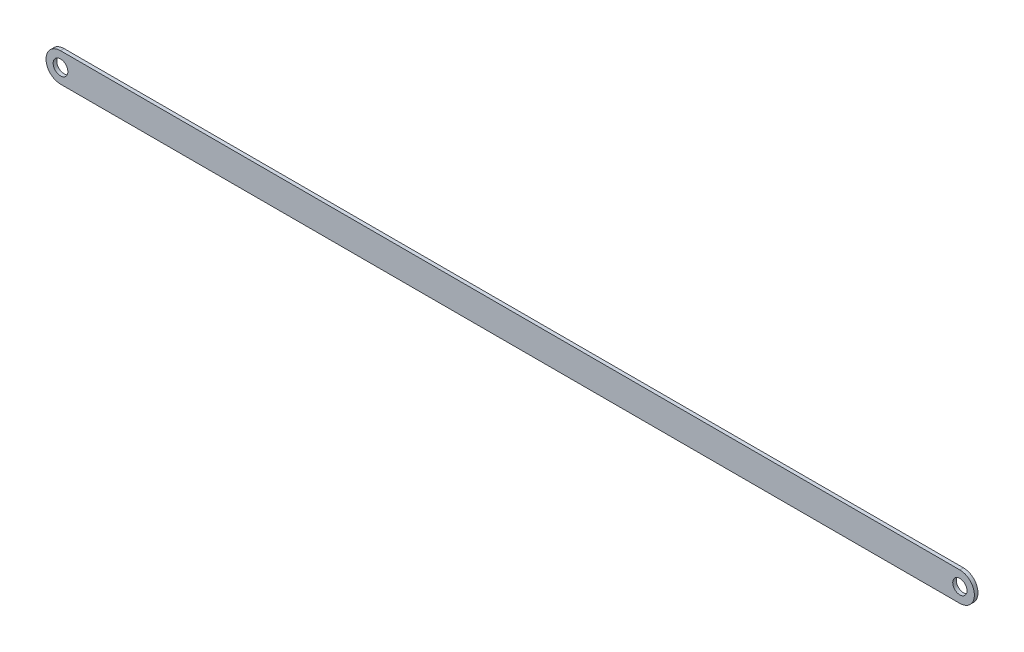
ISO-10303-21;
HEADER;
FILE_DESCRIPTION(('STEP AP214'),'2;1');
FILE_NAME('part.step','',(''),(''),'','','');
FILE_SCHEMA(('AUTOMOTIVE_DESIGN { 1 0 10303 214 1 1 1 1 }'));
ENDSEC;
DATA;
#1=APPLICATION_CONTEXT('core data for automotive mechanical design processes');
#2=APPLICATION_PROTOCOL_DEFINITION('international standard','automotive_design',2000,#1);
#3=PRODUCT_CONTEXT('',#1,'mechanical');
#4=PRODUCT('Part','Part','',(#3));
#5=PRODUCT_RELATED_PRODUCT_CATEGORY('part','',(#4));
#6=PRODUCT_DEFINITION_FORMATION('','',#4);
#7=PRODUCT_DEFINITION_CONTEXT('part definition',#1,'design');
#8=PRODUCT_DEFINITION('design','',#6,#7);
#9=PRODUCT_DEFINITION_SHAPE('','',#8);
#10=(LENGTH_UNIT() NAMED_UNIT(*) SI_UNIT(.MILLI.,.METRE.));
#11=(NAMED_UNIT(*) PLANE_ANGLE_UNIT() SI_UNIT($,.RADIAN.));
#12=(NAMED_UNIT(*) SI_UNIT($,.STERADIAN.) SOLID_ANGLE_UNIT());
#13=UNCERTAINTY_MEASURE_WITH_UNIT(LENGTH_MEASURE(1.E-05),#10,'distance_accuracy_value','');
#14=(GEOMETRIC_REPRESENTATION_CONTEXT(3) GLOBAL_UNCERTAINTY_ASSIGNED_CONTEXT((#13)) GLOBAL_UNIT_ASSIGNED_CONTEXT((#10,
#11,#12)) REPRESENTATION_CONTEXT('',''));
#15=CARTESIAN_POINT('',(0.,0.,0.));
#16=DIRECTION('',(0.,0.,1.));
#17=DIRECTION('',(1.,0.,0.));
#18=AXIS2_PLACEMENT_3D('',#15,#16,#17);
#19=CARTESIAN_POINT('',(0.,-12.7,3.175));
#20=DIRECTION('',(0.,1.,0.));
#21=DIRECTION('',(0.,0.,1.));
#22=AXIS2_PLACEMENT_3D('',#19,#20,#21);
#23=PLANE('',#22);
#24=DIRECTION('',(1.,0.,0.));
#25=VECTOR('',#24,1.);
#26=CARTESIAN_POINT('',(0.,-12.7,0.));
#27=LINE('',#26,#25);
#28=CARTESIAN_POINT('',(0.,-12.7,0.));
#29=VERTEX_POINT('',#28);
#30=CARTESIAN_POINT('',(787.4,-12.7,0.));
#31=VERTEX_POINT('',#30);
#32=EDGE_CURVE('E104',#29,#31,#27,.T.);
#33=ORIENTED_EDGE('',*,*,#32,.T.);
#34=DIRECTION('',(0.,0.,-1.));
#35=VECTOR('',#34,1.);
#36=CARTESIAN_POINT('',(787.4,-12.7,3.175));
#37=LINE('',#36,#35);
#38=CARTESIAN_POINT('',(787.4,-12.7,3.175));
#39=VERTEX_POINT('',#38);
#40=EDGE_CURVE('E11',#39,#31,#37,.T.);
#41=ORIENTED_EDGE('',*,*,#40,.F.);
#42=DIRECTION('',(1.,0.,0.));
#43=VECTOR('',#42,1.);
#44=CARTESIAN_POINT('',(0.,-12.7,3.175));
#45=LINE('',#44,#43);
#46=CARTESIAN_POINT('',(0.,-12.7,3.175));
#47=VERTEX_POINT('',#46);
#48=EDGE_CURVE('E83',#47,#39,#45,.T.);
#49=ORIENTED_EDGE('',*,*,#48,.F.);
#50=DIRECTION('',(0.,0.,-1.));
#51=VECTOR('',#50,1.);
#52=CARTESIAN_POINT('',(0.,-12.7,3.175));
#53=LINE('',#52,#51);
#54=EDGE_CURVE('E94',#47,#29,#53,.T.);
#55=ORIENTED_EDGE('',*,*,#54,.T.);
#56=EDGE_LOOP('',(#33,#41,#49,#55));
#57=FACE_BOUND('',#56,.T.);
#58=ADVANCED_FACE('F35',(#57),#23,.F.);
#59=CARTESIAN_POINT('',(787.4,0.,3.175));
#60=DIRECTION('',(0.,0.,-1.));
#61=DIRECTION('',(-1.,0.,0.));
#62=AXIS2_PLACEMENT_3D('',#59,#60,#61);
#63=CYLINDRICAL_SURFACE('',#62,12.7);
#64=CARTESIAN_POINT('',(787.4,0.,0.));
#65=DIRECTION('',(0.,0.,1.));
#66=DIRECTION('',(1.,0.,0.));
#67=AXIS2_PLACEMENT_3D('',#64,#65,#66);
#68=CIRCLE('',#67,12.7);
#69=CARTESIAN_POINT('',(787.4,12.7,0.));
#70=VERTEX_POINT('',#69);
#71=EDGE_CURVE('E88',#31,#70,#68,.T.);
#72=ORIENTED_EDGE('',*,*,#71,.T.);
#73=DIRECTION('',(0.,0.,-1.));
#74=VECTOR('',#73,1.);
#75=CARTESIAN_POINT('',(787.4,12.7,3.175));
#76=LINE('',#75,#74);
#77=CARTESIAN_POINT('',(787.4,12.7,3.175));
#78=VERTEX_POINT('',#77);
#79=EDGE_CURVE('E44',#78,#70,#76,.T.);
#80=ORIENTED_EDGE('',*,*,#79,.F.);
#81=CARTESIAN_POINT('',(787.4,0.,3.175));
#82=DIRECTION('',(0.,0.,1.));
#83=DIRECTION('',(1.,0.,0.));
#84=AXIS2_PLACEMENT_3D('',#81,#82,#83);
#85=CIRCLE('',#84,12.7);
#86=EDGE_CURVE('E78',#39,#78,#85,.T.);
#87=ORIENTED_EDGE('',*,*,#86,.F.);
#88=ORIENTED_EDGE('',*,*,#40,.T.);
#89=EDGE_LOOP('',(#72,#80,#87,#88));
#90=FACE_BOUND('',#89,.T.);
#91=ADVANCED_FACE('F87',(#90),#63,.T.);
#92=CARTESIAN_POINT('',(0.,12.7,3.175));
#93=DIRECTION('',(0.,1.,0.));
#94=DIRECTION('',(0.,0.,1.));
#95=AXIS2_PLACEMENT_3D('',#92,#93,#94);
#96=PLANE('',#95);
#97=DIRECTION('',(1.,0.,0.));
#98=VECTOR('',#97,1.);
#99=CARTESIAN_POINT('',(0.,12.7,0.));
#100=LINE('',#99,#98);
#101=CARTESIAN_POINT('',(0.,12.7,0.));
#102=VERTEX_POINT('',#101);
#103=EDGE_CURVE('E108',#102,#70,#100,.T.);
#104=ORIENTED_EDGE('',*,*,#103,.F.);
#105=DIRECTION('',(0.,0.,-1.));
#106=VECTOR('',#105,1.);
#107=CARTESIAN_POINT('',(0.,12.7,3.175));
#108=LINE('',#107,#106);
#109=CARTESIAN_POINT('',(0.,12.7,3.175));
#110=VERTEX_POINT('',#109);
#111=EDGE_CURVE('E68',#110,#102,#108,.T.);
#112=ORIENTED_EDGE('',*,*,#111,.F.);
#113=DIRECTION('',(1.,0.,0.));
#114=VECTOR('',#113,1.);
#115=CARTESIAN_POINT('',(0.,12.7,3.175));
#116=LINE('',#115,#114);
#117=EDGE_CURVE('E81',#110,#78,#116,.T.);
#118=ORIENTED_EDGE('',*,*,#117,.T.);
#119=ORIENTED_EDGE('',*,*,#79,.T.);
#120=EDGE_LOOP('',(#104,#112,#118,#119));
#121=FACE_BOUND('',#120,.T.);
#122=ADVANCED_FACE('F92',(#121),#96,.T.);
#123=CARTESIAN_POINT('',(0.,0.,3.175));
#124=DIRECTION('',(0.,0.,-1.));
#125=DIRECTION('',(-1.,0.,0.));
#126=AXIS2_PLACEMENT_3D('',#123,#124,#125);
#127=CYLINDRICAL_SURFACE('',#126,6.43006976920332);
#128=CARTESIAN_POINT('',(0.,0.,3.175));
#129=DIRECTION('',(0.,0.,1.));
#130=DIRECTION('',(1.,0.,0.));
#131=AXIS2_PLACEMENT_3D('',#128,#129,#130);
#132=CIRCLE('',#131,6.43006976920332);
#133=CARTESIAN_POINT('',(6.43006976920332,0.,3.175));
#134=VERTEX_POINT('',#133);
#135=EDGE_CURVE('E146',#134,#134,#132,.T.);
#136=ORIENTED_EDGE('',*,*,#135,.T.);
#137=EDGE_LOOP('',(#136));
#138=FACE_BOUND('',#137,.T.);
#139=CARTESIAN_POINT('',(0.,0.,0.));
#140=DIRECTION('',(0.,0.,1.));
#141=DIRECTION('',(1.,0.,0.));
#142=AXIS2_PLACEMENT_3D('',#139,#140,#141);
#143=CIRCLE('',#142,6.43006976920332);
#144=CARTESIAN_POINT('',(6.43006976920332,0.,0.));
#145=VERTEX_POINT('',#144);
#146=EDGE_CURVE('E101',#145,#145,#143,.T.);
#147=ORIENTED_EDGE('',*,*,#146,.F.);
#148=EDGE_LOOP('',(#147));
#149=FACE_BOUND('',#148,.T.);
#150=ADVANCED_FACE('F135',(#138,#149),#127,.F.);
#151=CARTESIAN_POINT('',(787.4,0.,3.175));
#152=DIRECTION('',(0.,0.,-1.));
#153=DIRECTION('',(-1.,0.,0.));
#154=AXIS2_PLACEMENT_3D('',#151,#152,#153);
#155=CYLINDRICAL_SURFACE('',#154,6.24775672436994);
#156=CARTESIAN_POINT('',(787.4,0.,3.175));
#157=DIRECTION('',(0.,0.,1.));
#158=DIRECTION('',(1.,0.,0.));
#159=AXIS2_PLACEMENT_3D('',#156,#157,#158);
#160=CIRCLE('',#159,6.24775672436994);
#161=CARTESIAN_POINT('',(793.64775672437,0.,3.175));
#162=VERTEX_POINT('',#161);
#163=EDGE_CURVE('E111',#162,#162,#160,.T.);
#164=ORIENTED_EDGE('',*,*,#163,.T.);
#165=EDGE_LOOP('',(#164));
#166=FACE_BOUND('',#165,.T.);
#167=CARTESIAN_POINT('',(787.4,0.,0.));
#168=DIRECTION('',(0.,0.,1.));
#169=DIRECTION('',(1.,0.,0.));
#170=AXIS2_PLACEMENT_3D('',#167,#168,#169);
#171=CIRCLE('',#170,6.24775672436994);
#172=CARTESIAN_POINT('',(793.64775672437,0.,0.));
#173=VERTEX_POINT('',#172);
#174=EDGE_CURVE('E98',#173,#173,#171,.T.);
#175=ORIENTED_EDGE('',*,*,#174,.F.);
#176=EDGE_LOOP('',(#175));
#177=FACE_BOUND('',#176,.T.);
#178=ADVANCED_FACE('F37',(#166,#177),#155,.F.);
#179=CARTESIAN_POINT('',(0.,0.,3.175));
#180=DIRECTION('',(0.,0.,-1.));
#181=DIRECTION('',(-1.,0.,0.));
#182=AXIS2_PLACEMENT_3D('',#179,#180,#181);
#183=CYLINDRICAL_SURFACE('',#182,12.7);
#184=CARTESIAN_POINT('',(0.,0.,0.));
#185=DIRECTION('',(0.,0.,1.));
#186=DIRECTION('',(1.,0.,0.));
#187=AXIS2_PLACEMENT_3D('',#184,#185,#186);
#188=CIRCLE('',#187,12.7);
#189=EDGE_CURVE('E71',#102,#29,#188,.T.);
#190=ORIENTED_EDGE('',*,*,#189,.T.);
#191=ORIENTED_EDGE('',*,*,#54,.F.);
#192=CARTESIAN_POINT('',(0.,0.,3.175));
#193=DIRECTION('',(0.,0.,1.));
#194=DIRECTION('',(1.,0.,0.));
#195=AXIS2_PLACEMENT_3D('',#192,#193,#194);
#196=CIRCLE('',#195,12.7);
#197=EDGE_CURVE('E52',#110,#47,#196,.T.);
#198=ORIENTED_EDGE('',*,*,#197,.F.);
#199=ORIENTED_EDGE('',*,*,#111,.T.);
#200=EDGE_LOOP('',(#190,#191,#198,#199));
#201=FACE_BOUND('',#200,.T.);
#202=ADVANCED_FACE('F123',(#201),#183,.T.);
#203=CARTESIAN_POINT('',(0.,0.,3.175));
#204=DIRECTION('',(0.,0.,1.));
#205=DIRECTION('',(1.,0.,0.));
#206=AXIS2_PLACEMENT_3D('',#203,#204,#205);
#207=PLANE('',#206);
#208=ORIENTED_EDGE('',*,*,#163,.F.);
#209=EDGE_LOOP('',(#208));
#210=FACE_BOUND('',#209,.T.);
#211=ORIENTED_EDGE('',*,*,#135,.F.);
#212=EDGE_LOOP('',(#211));
#213=FACE_BOUND('',#212,.T.);
#214=ORIENTED_EDGE('',*,*,#48,.T.);
#215=ORIENTED_EDGE('',*,*,#86,.T.);
#216=ORIENTED_EDGE('',*,*,#117,.F.);
#217=ORIENTED_EDGE('',*,*,#197,.T.);
#218=EDGE_LOOP('',(#214,#215,#216,#217));
#219=FACE_BOUND('',#218,.T.);
#220=ADVANCED_FACE('F79',(#210,#213,#219),#207,.T.);
#221=CARTESIAN_POINT('',(0.,0.,0.));
#222=DIRECTION('',(0.,0.,1.));
#223=DIRECTION('',(1.,0.,0.));
#224=AXIS2_PLACEMENT_3D('',#221,#222,#223);
#225=PLANE('',#224);
#226=ORIENTED_EDGE('',*,*,#174,.T.);
#227=EDGE_LOOP('',(#226));
#228=FACE_BOUND('',#227,.T.);
#229=ORIENTED_EDGE('',*,*,#146,.T.);
#230=EDGE_LOOP('',(#229));
#231=FACE_BOUND('',#230,.T.);
#232=ORIENTED_EDGE('',*,*,#32,.F.);
#233=ORIENTED_EDGE('',*,*,#189,.F.);
#234=ORIENTED_EDGE('',*,*,#103,.T.);
#235=ORIENTED_EDGE('',*,*,#71,.F.);
#236=EDGE_LOOP('',(#232,#233,#234,#235));
#237=FACE_BOUND('',#236,.T.);
#238=ADVANCED_FACE('F116',(#228,#231,#237),#225,.F.);
#239=CLOSED_SHELL('',(#58,#91,#122,#150,#178,#202,#220,#238));
#240=MANIFOLD_SOLID_BREP('B2',#239);
#241=ADVANCED_BREP_SHAPE_REPRESENTATION('',(#18,#240),#14);
#242=SHAPE_DEFINITION_REPRESENTATION(#9,#241);
ENDSEC;
END-ISO-10303-21;
